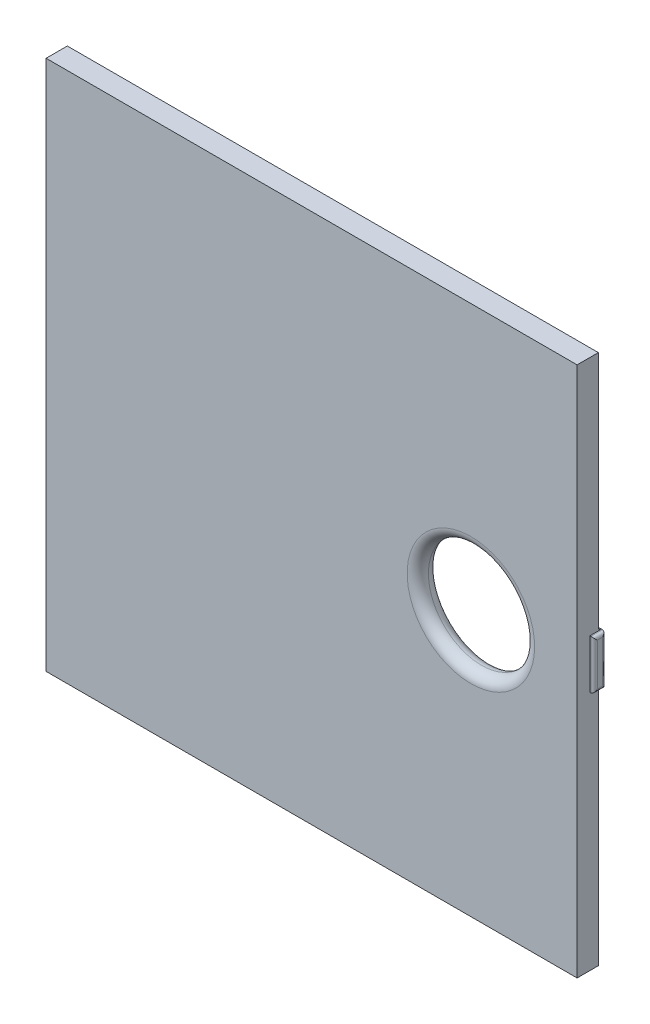
ISO-10303-21;
HEADER;
FILE_DESCRIPTION(('STEP AP214'),'2;1');
FILE_NAME('part.step','',(''),(''),'','','');
FILE_SCHEMA(('AUTOMOTIVE_DESIGN { 1 0 10303 214 1 1 1 1 }'));
ENDSEC;
DATA;
#1=APPLICATION_CONTEXT('core data for automotive mechanical design processes');
#2=APPLICATION_PROTOCOL_DEFINITION('international standard','automotive_design',2000,#1);
#3=PRODUCT_CONTEXT('',#1,'mechanical');
#4=PRODUCT('Part','Part','',(#3));
#5=PRODUCT_RELATED_PRODUCT_CATEGORY('part','',(#4));
#6=PRODUCT_DEFINITION_FORMATION('','',#4);
#7=PRODUCT_DEFINITION_CONTEXT('part definition',#1,'design');
#8=PRODUCT_DEFINITION('design','',#6,#7);
#9=PRODUCT_DEFINITION_SHAPE('','',#8);
#10=(LENGTH_UNIT() NAMED_UNIT(*) SI_UNIT(.MILLI.,.METRE.));
#11=(NAMED_UNIT(*) PLANE_ANGLE_UNIT() SI_UNIT($,.RADIAN.));
#12=(NAMED_UNIT(*) SI_UNIT($,.STERADIAN.) SOLID_ANGLE_UNIT());
#13=UNCERTAINTY_MEASURE_WITH_UNIT(LENGTH_MEASURE(1.E-05),#10,'distance_accuracy_value','');
#14=(GEOMETRIC_REPRESENTATION_CONTEXT(3) GLOBAL_UNCERTAINTY_ASSIGNED_CONTEXT((#13)) GLOBAL_UNIT_ASSIGNED_CONTEXT((#10,
#11,#12)) REPRESENTATION_CONTEXT('',''));
#15=CARTESIAN_POINT('',(0.,0.,0.));
#16=DIRECTION('',(0.,0.,1.));
#17=DIRECTION('',(1.,0.,0.));
#18=AXIS2_PLACEMENT_3D('',#15,#16,#17);
#19=CARTESIAN_POINT('',(0.,0.,0.));
#20=DIRECTION('',(0.,0.,1.));
#21=DIRECTION('',(1.,0.,0.));
#22=AXIS2_PLACEMENT_3D('',#19,#20,#21);
#23=PLANE('',#22);
#24=CARTESIAN_POINT('',(15.,0.,0.));
#25=DIRECTION('',(0.,0.,1.));
#26=DIRECTION('',(1.,0.,0.));
#27=AXIS2_PLACEMENT_3D('',#24,#25,#26);
#28=CIRCLE('',#27,6.);
#29=CARTESIAN_POINT('',(21.,0.,0.));
#30=VERTEX_POINT('',#29);
#31=EDGE_CURVE('E42',#30,#30,#28,.T.);
#32=ORIENTED_EDGE('',*,*,#31,.T.);
#33=EDGE_LOOP('',(#32));
#34=FACE_BOUND('',#33,.T.);
#35=DIRECTION('',(0.,-1.,0.));
#36=VECTOR('',#35,1.);
#37=CARTESIAN_POINT('',(23.5,0.,0.));
#38=LINE('',#37,#36);
#39=CARTESIAN_POINT('',(23.5,2.59999999999999,0.));
#40=VERTEX_POINT('',#39);
#41=CARTESIAN_POINT('',(23.5,-2.60000000000001,0.));
#42=VERTEX_POINT('',#41);
#43=EDGE_CURVE('E57',#40,#42,#38,.T.);
#44=ORIENTED_EDGE('',*,*,#43,.T.);
#45=DIRECTION('',(-1.,0.,0.));
#46=VECTOR('',#45,1.);
#47=CARTESIAN_POINT('',(25.,-2.60000000000001,0.));
#48=LINE('',#47,#46);
#49=CARTESIAN_POINT('',(25.,-2.60000000000001,0.));
#50=VERTEX_POINT('',#49);
#51=EDGE_CURVE('E265',#42,#50,#48,.F.);
#52=ORIENTED_EDGE('',*,*,#51,.T.);
#53=DIRECTION('',(0.,1.,0.));
#54=VECTOR('',#53,1.);
#55=CARTESIAN_POINT('',(25.,25.,0.));
#56=LINE('',#55,#54);
#57=CARTESIAN_POINT('',(25.,-25.,0.));
#58=VERTEX_POINT('',#57);
#59=EDGE_CURVE('E382',#58,#50,#56,.T.);
#60=ORIENTED_EDGE('',*,*,#59,.F.);
#61=DIRECTION('',(1.,0.,0.));
#62=VECTOR('',#61,1.);
#63=CARTESIAN_POINT('',(-25.,-25.,0.));
#64=LINE('',#63,#62);
#65=CARTESIAN_POINT('',(-25.,-25.,0.));
#66=VERTEX_POINT('',#65);
#67=EDGE_CURVE('E372',#66,#58,#64,.T.);
#68=ORIENTED_EDGE('',*,*,#67,.F.);
#69=DIRECTION('',(0.,-1.,0.));
#70=VECTOR('',#69,1.);
#71=CARTESIAN_POINT('',(-25.,25.,0.));
#72=LINE('',#71,#70);
#73=CARTESIAN_POINT('',(-25.,-21.8141428428542,0.));
#74=VERTEX_POINT('',#73);
#75=EDGE_CURVE('E379',#74,#66,#72,.T.);
#76=ORIENTED_EDGE('',*,*,#75,.F.);
#77=DIRECTION('',(1.,0.,0.));
#78=VECTOR('',#77,1.);
#79=CARTESIAN_POINT('',(0.,-21.8141428428542,0.));
#80=LINE('',#79,#78);
#81=CARTESIAN_POINT('',(-23.0858571571457,-21.8141428428542,0.));
#82=VERTEX_POINT('',#81);
#83=EDGE_CURVE('E346',#74,#82,#80,.T.);
#84=ORIENTED_EDGE('',*,*,#83,.T.);
#85=DIRECTION('',(0.,-1.,0.));
#86=VECTOR('',#85,1.);
#87=CARTESIAN_POINT('',(-23.0858571571457,0.,0.));
#88=LINE('',#87,#86);
#89=CARTESIAN_POINT('',(-23.0858571571457,-17.7858571571458,0.));
#90=VERTEX_POINT('',#89);
#91=EDGE_CURVE('E350',#82,#90,#88,.F.);
#92=ORIENTED_EDGE('',*,*,#91,.T.);
#93=DIRECTION('',(-1.,0.,0.));
#94=VECTOR('',#93,1.);
#95=CARTESIAN_POINT('',(0.,-17.7858571571458,0.));
#96=LINE('',#95,#94);
#97=CARTESIAN_POINT('',(-25.,-17.7858571571458,0.));
#98=VERTEX_POINT('',#97);
#99=EDGE_CURVE('E348',#90,#98,#96,.T.);
#100=ORIENTED_EDGE('',*,*,#99,.T.);
#101=CARTESIAN_POINT('',(-25.,17.7858571571457,0.));
#102=VERTEX_POINT('',#101);
#103=EDGE_CURVE('E378',#102,#98,#72,.T.);
#104=ORIENTED_EDGE('',*,*,#103,.F.);
#105=DIRECTION('',(1.,0.,0.));
#106=VECTOR('',#105,1.);
#107=CARTESIAN_POINT('',(0.,17.7858571571457,0.));
#108=LINE('',#107,#106);
#109=CARTESIAN_POINT('',(-23.0858571571457,17.7858571571457,0.));
#110=VERTEX_POINT('',#109);
#111=EDGE_CURVE('E355',#102,#110,#108,.T.);
#112=ORIENTED_EDGE('',*,*,#111,.T.);
#113=DIRECTION('',(0.,-1.,0.));
#114=VECTOR('',#113,1.);
#115=CARTESIAN_POINT('',(-23.0858571571457,0.,0.));
#116=LINE('',#115,#114);
#117=CARTESIAN_POINT('',(-23.0858571571457,21.8141428428543,0.));
#118=VERTEX_POINT('',#117);
#119=EDGE_CURVE('E357',#110,#118,#116,.F.);
#120=ORIENTED_EDGE('',*,*,#119,.T.);
#121=DIRECTION('',(-1.,0.,0.));
#122=VECTOR('',#121,1.);
#123=CARTESIAN_POINT('',(0.,21.8141428428543,0.));
#124=LINE('',#123,#122);
#125=CARTESIAN_POINT('',(-25.,21.8141428428543,0.));
#126=VERTEX_POINT('',#125);
#127=EDGE_CURVE('E352',#118,#126,#124,.T.);
#128=ORIENTED_EDGE('',*,*,#127,.T.);
#129=CARTESIAN_POINT('',(-25.,25.,0.));
#130=VERTEX_POINT('',#129);
#131=EDGE_CURVE('E375',#130,#126,#72,.T.);
#132=ORIENTED_EDGE('',*,*,#131,.F.);
#133=DIRECTION('',(-1.,0.,0.));
#134=VECTOR('',#133,1.);
#135=CARTESIAN_POINT('',(-25.,25.,0.));
#136=LINE('',#135,#134);
#137=CARTESIAN_POINT('',(25.,25.,0.));
#138=VERTEX_POINT('',#137);
#139=EDGE_CURVE('E380',#138,#130,#136,.T.);
#140=ORIENTED_EDGE('',*,*,#139,.F.);
#141=CARTESIAN_POINT('',(25.,2.59999999999999,0.));
#142=VERTEX_POINT('',#141);
#143=EDGE_CURVE('E385',#142,#138,#56,.T.);
#144=ORIENTED_EDGE('',*,*,#143,.F.);
#145=DIRECTION('',(1.,0.,0.));
#146=VECTOR('',#145,1.);
#147=CARTESIAN_POINT('',(23.8,2.59999999999999,0.));
#148=LINE('',#147,#146);
#149=EDGE_CURVE('E269',#142,#40,#148,.F.);
#150=ORIENTED_EDGE('',*,*,#149,.T.);
#151=EDGE_LOOP('',(#44,#52,#60,#68,#76,#84,#92,#100,#104,#112,#120,#128,#132,#140,#144,#150));
#152=FACE_BOUND('',#151,.T.);
#153=ADVANCED_FACE('F33',(#34,#152),#23,.F.);
#154=CARTESIAN_POINT('',(25.,25.,2.));
#155=DIRECTION('',(-1.,0.,0.));
#156=DIRECTION('',(0.,-1.,0.));
#157=AXIS2_PLACEMENT_3D('',#154,#155,#156);
#158=PLANE('',#157);
#159=DIRECTION('',(0.,0.,1.));
#160=VECTOR('',#159,1.);
#161=CARTESIAN_POINT('',(25.,2.29999999999999,2.));
#162=LINE('',#161,#160);
#163=CARTESIAN_POINT('',(25.,2.29999999999999,-0.29999999999999));
#164=VERTEX_POINT('',#163);
#165=CARTESIAN_POINT('',(25.,2.29999999999999,0.800000000000011));
#166=VERTEX_POINT('',#165);
#167=EDGE_CURVE('E49',#164,#166,#162,.T.);
#168=ORIENTED_EDGE('',*,*,#167,.F.);
#169=CARTESIAN_POINT('',(25.,2.59999999999999,-0.3));
#170=DIRECTION('',(-1.,0.,0.));
#171=DIRECTION('',(0.,-1.,0.));
#172=AXIS2_PLACEMENT_3D('',#169,#170,#171);
#173=CIRCLE('',#172,0.3);
#174=EDGE_CURVE('E245',#164,#142,#173,.T.);
#175=ORIENTED_EDGE('',*,*,#174,.T.);
#176=ORIENTED_EDGE('',*,*,#143,.T.);
#177=DIRECTION('',(0.,0.,-1.));
#178=VECTOR('',#177,1.);
#179=CARTESIAN_POINT('',(25.,25.,2.));
#180=LINE('',#179,#178);
#181=CARTESIAN_POINT('',(25.,25.,2.));
#182=VERTEX_POINT('',#181);
#183=EDGE_CURVE('E359',#182,#138,#180,.T.);
#184=ORIENTED_EDGE('',*,*,#183,.F.);
#185=DIRECTION('',(0.,1.,0.));
#186=VECTOR('',#185,1.);
#187=CARTESIAN_POINT('',(25.,25.,2.));
#188=LINE('',#187,#186);
#189=CARTESIAN_POINT('',(25.,-25.,2.));
#190=VERTEX_POINT('',#189);
#191=EDGE_CURVE('E374',#190,#182,#188,.T.);
#192=ORIENTED_EDGE('',*,*,#191,.F.);
#193=DIRECTION('',(0.,0.,-1.));
#194=VECTOR('',#193,1.);
#195=CARTESIAN_POINT('',(25.,-25.,2.));
#196=LINE('',#195,#194);
#197=EDGE_CURVE('E368',#190,#58,#196,.T.);
#198=ORIENTED_EDGE('',*,*,#197,.T.);
#199=ORIENTED_EDGE('',*,*,#59,.T.);
#200=CARTESIAN_POINT('',(25.,-2.60000000000001,-0.3));
#201=DIRECTION('',(-1.,0.,0.));
#202=DIRECTION('',(0.,-1.,0.));
#203=AXIS2_PLACEMENT_3D('',#200,#201,#202);
#204=CIRCLE('',#203,0.3);
#205=CARTESIAN_POINT('',(25.,-2.30000000000001,-0.29999999999999));
#206=VERTEX_POINT('',#205);
#207=EDGE_CURVE('E262',#50,#206,#204,.T.);
#208=ORIENTED_EDGE('',*,*,#207,.T.);
#209=DIRECTION('',(0.,0.,-1.));
#210=VECTOR('',#209,1.);
#211=CARTESIAN_POINT('',(25.,-2.30000000000001,2.));
#212=LINE('',#211,#210);
#213=CARTESIAN_POINT('',(25.,-2.30000000000001,0.800000000000011));
#214=VERTEX_POINT('',#213);
#215=EDGE_CURVE('E298',#214,#206,#212,.T.);
#216=ORIENTED_EDGE('',*,*,#215,.F.);
#217=DIRECTION('',(0.,-1.,0.));
#218=VECTOR('',#217,1.);
#219=CARTESIAN_POINT('',(25.,25.,0.800000000000011));
#220=LINE('',#219,#218);
#221=EDGE_CURVE('E300',#166,#214,#220,.T.);
#222=ORIENTED_EDGE('',*,*,#221,.F.);
#223=EDGE_LOOP('',(#168,#175,#176,#184,#192,#198,#199,#208,#216,#222));
#224=FACE_BOUND('',#223,.T.);
#225=ADVANCED_FACE('F486',(#224),#158,.F.);
#226=CARTESIAN_POINT('',(-25.,25.,2.));
#227=DIRECTION('',(1.,0.,0.));
#228=DIRECTION('',(0.,1.,0.));
#229=AXIS2_PLACEMENT_3D('',#226,#227,#228);
#230=PLANE('',#229);
#231=DIRECTION('',(0.,0.,-1.));
#232=VECTOR('',#231,1.);
#233=CARTESIAN_POINT('',(-25.,-18.5,2.));
#234=LINE('',#233,#232);
#235=CARTESIAN_POINT('',(-25.,-18.5,1.80000000000007));
#236=VERTEX_POINT('',#235);
#237=CARTESIAN_POINT('',(-25.,-18.5,-0.299999999999931));
#238=VERTEX_POINT('',#237);
#239=EDGE_CURVE('E425',#236,#238,#234,.T.);
#240=ORIENTED_EDGE('',*,*,#239,.F.);
#241=DIRECTION('',(0.,1.,0.));
#242=VECTOR('',#241,1.);
#243=CARTESIAN_POINT('',(-25.,-21.1,1.80000000000008));
#244=LINE('',#243,#242);
#245=CARTESIAN_POINT('',(-25.,-21.1,1.80000000000008));
#246=VERTEX_POINT('',#245);
#247=EDGE_CURVE('E337',#236,#246,#244,.F.);
#248=ORIENTED_EDGE('',*,*,#247,.T.);
#249=DIRECTION('',(0.,0.,1.));
#250=VECTOR('',#249,1.);
#251=CARTESIAN_POINT('',(-25.,-21.1,2.));
#252=LINE('',#251,#250);
#253=CARTESIAN_POINT('',(-25.,-21.1,-0.299999999999922));
#254=VERTEX_POINT('',#253);
#255=EDGE_CURVE('E423',#254,#246,#252,.T.);
#256=ORIENTED_EDGE('',*,*,#255,.F.);
#257=CARTESIAN_POINT('',(-25.,-21.8141428428542,-1.));
#258=DIRECTION('',(1.,0.,0.));
#259=DIRECTION('',(0.,1.,0.));
#260=AXIS2_PLACEMENT_3D('',#257,#258,#259);
#261=CIRCLE('',#260,1.);
#262=EDGE_CURVE('E328',#254,#74,#261,.T.);
#263=ORIENTED_EDGE('',*,*,#262,.T.);
#264=ORIENTED_EDGE('',*,*,#75,.T.);
#265=DIRECTION('',(0.,0.,-1.));
#266=VECTOR('',#265,1.);
#267=CARTESIAN_POINT('',(-25.,-25.,2.));
#268=LINE('',#267,#266);
#269=CARTESIAN_POINT('',(-25.,-25.,2.));
#270=VERTEX_POINT('',#269);
#271=EDGE_CURVE('E365',#270,#66,#268,.T.);
#272=ORIENTED_EDGE('',*,*,#271,.F.);
#273=DIRECTION('',(0.,-1.,0.));
#274=VECTOR('',#273,1.);
#275=CARTESIAN_POINT('',(-25.,25.,2.));
#276=LINE('',#275,#274);
#277=CARTESIAN_POINT('',(-25.,25.,2.));
#278=VERTEX_POINT('',#277);
#279=EDGE_CURVE('E387',#278,#270,#276,.T.);
#280=ORIENTED_EDGE('',*,*,#279,.F.);
#281=DIRECTION('',(0.,0.,-1.));
#282=VECTOR('',#281,1.);
#283=CARTESIAN_POINT('',(-25.,25.,2.));
#284=LINE('',#283,#282);
#285=EDGE_CURVE('E362',#278,#130,#284,.T.);
#286=ORIENTED_EDGE('',*,*,#285,.T.);
#287=ORIENTED_EDGE('',*,*,#131,.T.);
#288=CARTESIAN_POINT('',(-25.,21.8141428428543,-1.));
#289=DIRECTION('',(1.,0.,0.));
#290=DIRECTION('',(0.,1.,0.));
#291=AXIS2_PLACEMENT_3D('',#288,#289,#290);
#292=CIRCLE('',#291,1.);
#293=CARTESIAN_POINT('',(-25.,21.1,-0.299999999999995));
#294=VERTEX_POINT('',#293);
#295=EDGE_CURVE('E332',#126,#294,#292,.T.);
#296=ORIENTED_EDGE('',*,*,#295,.T.);
#297=DIRECTION('',(0.,0.,1.));
#298=VECTOR('',#297,1.);
#299=CARTESIAN_POINT('',(-25.,21.1,2.));
#300=LINE('',#299,#298);
#301=CARTESIAN_POINT('',(-25.,21.1,1.8));
#302=VERTEX_POINT('',#301);
#303=EDGE_CURVE('E393',#294,#302,#300,.T.);
#304=ORIENTED_EDGE('',*,*,#303,.T.);
#305=DIRECTION('',(0.,-1.,0.));
#306=VECTOR('',#305,1.);
#307=CARTESIAN_POINT('',(-25.,25.,1.8));
#308=LINE('',#307,#306);
#309=CARTESIAN_POINT('',(-25.,18.5,1.8));
#310=VERTEX_POINT('',#309);
#311=EDGE_CURVE('E340',#302,#310,#308,.T.);
#312=ORIENTED_EDGE('',*,*,#311,.T.);
#313=DIRECTION('',(0.,0.,-1.));
#314=VECTOR('',#313,1.);
#315=CARTESIAN_POINT('',(-25.,18.5,2.));
#316=LINE('',#315,#314);
#317=CARTESIAN_POINT('',(-25.,18.5,-0.299999999999995));
#318=VERTEX_POINT('',#317);
#319=EDGE_CURVE('E395',#310,#318,#316,.T.);
#320=ORIENTED_EDGE('',*,*,#319,.T.);
#321=CARTESIAN_POINT('',(-25.,17.7858571571457,-1.));
#322=DIRECTION('',(1.,0.,0.));
#323=DIRECTION('',(0.,1.,0.));
#324=AXIS2_PLACEMENT_3D('',#321,#322,#323);
#325=CIRCLE('',#324,1.);
#326=EDGE_CURVE('E330',#318,#102,#325,.T.);
#327=ORIENTED_EDGE('',*,*,#326,.T.);
#328=ORIENTED_EDGE('',*,*,#103,.T.);
#329=CARTESIAN_POINT('',(-25.,-17.7858571571458,-1.));
#330=DIRECTION('',(1.,0.,0.));
#331=DIRECTION('',(0.,1.,0.));
#332=AXIS2_PLACEMENT_3D('',#329,#330,#331);
#333=CIRCLE('',#332,1.);
#334=EDGE_CURVE('E325',#98,#238,#333,.T.);
#335=ORIENTED_EDGE('',*,*,#334,.T.);
#336=EDGE_LOOP('',(#240,#248,#256,#263,#264,#272,#280,#286,#287,#296,#304,#312,#320,#327,#328,#335));
#337=FACE_BOUND('',#336,.T.);
#338=ADVANCED_FACE('F514',(#337),#230,.F.);
#339=CARTESIAN_POINT('',(-25.,25.,2.));
#340=DIRECTION('',(0.,-1.,0.));
#341=DIRECTION('',(0.,0.,-1.));
#342=AXIS2_PLACEMENT_3D('',#339,#340,#341);
#343=PLANE('',#342);
#344=ORIENTED_EDGE('',*,*,#139,.T.);
#345=ORIENTED_EDGE('',*,*,#285,.F.);
#346=DIRECTION('',(-1.,0.,0.));
#347=VECTOR('',#346,1.);
#348=CARTESIAN_POINT('',(-25.,25.,2.));
#349=LINE('',#348,#347);
#350=EDGE_CURVE('E389',#182,#278,#349,.T.);
#351=ORIENTED_EDGE('',*,*,#350,.F.);
#352=ORIENTED_EDGE('',*,*,#183,.T.);
#353=EDGE_LOOP('',(#344,#345,#351,#352));
#354=FACE_BOUND('',#353,.T.);
#355=ADVANCED_FACE('F561',(#354),#343,.F.);
#356=CARTESIAN_POINT('',(-25.,-25.,2.));
#357=DIRECTION('',(0.,1.,0.));
#358=DIRECTION('',(0.,0.,1.));
#359=AXIS2_PLACEMENT_3D('',#356,#357,#358);
#360=PLANE('',#359);
#361=ORIENTED_EDGE('',*,*,#67,.T.);
#362=ORIENTED_EDGE('',*,*,#197,.F.);
#363=DIRECTION('',(1.,0.,0.));
#364=VECTOR('',#363,1.);
#365=CARTESIAN_POINT('',(-25.,-25.,2.));
#366=LINE('',#365,#364);
#367=EDGE_CURVE('E371',#270,#190,#366,.T.);
#368=ORIENTED_EDGE('',*,*,#367,.F.);
#369=ORIENTED_EDGE('',*,*,#271,.T.);
#370=EDGE_LOOP('',(#361,#362,#368,#369));
#371=FACE_BOUND('',#370,.T.);
#372=ADVANCED_FACE('F492',(#371),#360,.F.);
#373=CARTESIAN_POINT('',(0.,0.,2.));
#374=DIRECTION('',(0.,0.,1.));
#375=DIRECTION('',(1.,0.,0.));
#376=AXIS2_PLACEMENT_3D('',#373,#374,#375);
#377=PLANE('',#376);
#378=CARTESIAN_POINT('',(15.,0.,2.));
#379=DIRECTION('',(0.,0.,1.));
#380=DIRECTION('',(1.,0.,0.));
#381=AXIS2_PLACEMENT_3D('',#378,#379,#380);
#382=CIRCLE('',#381,6.);
#383=CARTESIAN_POINT('',(21.,0.,2.));
#384=VERTEX_POINT('',#383);
#385=EDGE_CURVE('E11',#384,#384,#382,.F.);
#386=ORIENTED_EDGE('',*,*,#385,.T.);
#387=EDGE_LOOP('',(#386));
#388=FACE_BOUND('',#387,.T.);
#389=ORIENTED_EDGE('',*,*,#191,.T.);
#390=ORIENTED_EDGE('',*,*,#350,.T.);
#391=ORIENTED_EDGE('',*,*,#279,.T.);
#392=ORIENTED_EDGE('',*,*,#367,.T.);
#393=EDGE_LOOP('',(#389,#390,#391,#392));
#394=FACE_BOUND('',#393,.T.);
#395=ADVANCED_FACE('F557',(#388,#394),#377,.T.);
#396=CARTESIAN_POINT('',(-23.8,18.5,0.800000000000004));
#397=DIRECTION('',(0.,0.,1.));
#398=DIRECTION('',(1.,0.,0.));
#399=AXIS2_PLACEMENT_3D('',#396,#397,#398);
#400=PLANE('',#399);
#401=DIRECTION('',(-1.,0.,0.));
#402=VECTOR('',#401,1.);
#403=CARTESIAN_POINT('',(-23.8,18.5,0.800000000000004));
#404=LINE('',#403,#402);
#405=CARTESIAN_POINT('',(-26.,18.5,0.800000000000004));
#406=VERTEX_POINT('',#405);
#407=CARTESIAN_POINT('',(-26.2,18.5,0.800000000000004));
#408=VERTEX_POINT('',#407);
#409=EDGE_CURVE('E406',#406,#408,#404,.T.);
#410=ORIENTED_EDGE('',*,*,#409,.F.);
#411=DIRECTION('',(0.,-1.,0.));
#412=VECTOR('',#411,1.);
#413=CARTESIAN_POINT('',(-26.,18.5,0.800000000000004));
#414=LINE('',#413,#412);
#415=CARTESIAN_POINT('',(-26.,21.1,0.800000000000004));
#416=VERTEX_POINT('',#415);
#417=EDGE_CURVE('E335',#406,#416,#414,.F.);
#418=ORIENTED_EDGE('',*,*,#417,.T.);
#419=DIRECTION('',(-1.,0.,0.));
#420=VECTOR('',#419,1.);
#421=CARTESIAN_POINT('',(-23.8,21.1,0.800000000000004));
#422=LINE('',#421,#420);
#423=CARTESIAN_POINT('',(-26.2,21.1,0.800000000000004));
#424=VERTEX_POINT('',#423);
#425=EDGE_CURVE('E397',#416,#424,#422,.T.);
#426=ORIENTED_EDGE('',*,*,#425,.T.);
#427=DIRECTION('',(0.,1.,0.));
#428=VECTOR('',#427,1.);
#429=CARTESIAN_POINT('',(-26.2,18.5,0.800000000000004));
#430=LINE('',#429,#428);
#431=EDGE_CURVE('E411',#408,#424,#430,.T.);
#432=ORIENTED_EDGE('',*,*,#431,.F.);
#433=EDGE_LOOP('',(#410,#418,#426,#432));
#434=FACE_BOUND('',#433,.T.);
#435=ADVANCED_FACE('F623',(#434),#400,.T.);
#436=CARTESIAN_POINT('',(-23.8,21.1,0.800000000000004));
#437=DIRECTION('',(0.,1.,0.));
#438=DIRECTION('',(-1.,0.,0.));
#439=AXIS2_PLACEMENT_3D('',#436,#437,#438);
#440=PLANE('',#439);
#441=ORIENTED_EDGE('',*,*,#303,.F.);
#442=DIRECTION('',(-1.,0.,0.));
#443=VECTOR('',#442,1.);
#444=CARTESIAN_POINT('',(-23.8,21.1,-0.299999999999995));
#445=LINE('',#444,#443);
#446=CARTESIAN_POINT('',(-26.2,21.1,-0.299999999999995));
#447=VERTEX_POINT('',#446);
#448=EDGE_CURVE('E402',#294,#447,#445,.T.);
#449=ORIENTED_EDGE('',*,*,#448,.T.);
#450=DIRECTION('',(0.,0.,-1.));
#451=VECTOR('',#450,1.);
#452=CARTESIAN_POINT('',(-26.2,21.1,0.800000000000004));
#453=LINE('',#452,#451);
#454=EDGE_CURVE('E420',#424,#447,#453,.T.);
#455=ORIENTED_EDGE('',*,*,#454,.F.);
#456=ORIENTED_EDGE('',*,*,#425,.F.);
#457=CARTESIAN_POINT('',(-26.,21.1,1.8));
#458=DIRECTION('',(0.,1.,0.));
#459=DIRECTION('',(-1.,0.,0.));
#460=AXIS2_PLACEMENT_3D('',#457,#458,#459);
#461=CIRCLE('',#460,1.);
#462=EDGE_CURVE('E303',#416,#302,#461,.F.);
#463=ORIENTED_EDGE('',*,*,#462,.T.);
#464=EDGE_LOOP('',(#441,#449,#455,#456,#463));
#465=FACE_BOUND('',#464,.T.);
#466=ADVANCED_FACE('F638',(#465),#440,.T.);
#467=CARTESIAN_POINT('',(-23.8,18.5,-0.299999999999995));
#468=DIRECTION('',(0.,-1.,0.));
#469=DIRECTION('',(1.,0.,0.));
#470=AXIS2_PLACEMENT_3D('',#467,#468,#469);
#471=PLANE('',#470);
#472=DIRECTION('',(-1.,0.,0.));
#473=VECTOR('',#472,1.);
#474=CARTESIAN_POINT('',(-23.8,18.5,-0.299999999999995));
#475=LINE('',#474,#473);
#476=CARTESIAN_POINT('',(-26.2,18.5,-0.299999999999995));
#477=VERTEX_POINT('',#476);
#478=EDGE_CURVE('E401',#318,#477,#475,.T.);
#479=ORIENTED_EDGE('',*,*,#478,.F.);
#480=ORIENTED_EDGE('',*,*,#319,.F.);
#481=CARTESIAN_POINT('',(-26.,18.5,1.8));
#482=DIRECTION('',(0.,-1.,0.));
#483=DIRECTION('',(1.,0.,0.));
#484=AXIS2_PLACEMENT_3D('',#481,#482,#483);
#485=CIRCLE('',#484,1.);
#486=EDGE_CURVE('E318',#310,#406,#485,.F.);
#487=ORIENTED_EDGE('',*,*,#486,.T.);
#488=ORIENTED_EDGE('',*,*,#409,.T.);
#489=DIRECTION('',(0.,0.,1.));
#490=VECTOR('',#489,1.);
#491=CARTESIAN_POINT('',(-26.2,18.5,-0.299999999999995));
#492=LINE('',#491,#490);
#493=EDGE_CURVE('E414',#477,#408,#492,.T.);
#494=ORIENTED_EDGE('',*,*,#493,.F.);
#495=EDGE_LOOP('',(#479,#480,#487,#488,#494));
#496=FACE_BOUND('',#495,.T.);
#497=ADVANCED_FACE('F648',(#496),#471,.T.);
#498=CARTESIAN_POINT('',(-23.8,21.1,-0.299999999999995));
#499=DIRECTION('',(0.,0.,-1.));
#500=DIRECTION('',(-1.,0.,0.));
#501=AXIS2_PLACEMENT_3D('',#498,#499,#500);
#502=PLANE('',#501);
#503=CARTESIAN_POINT('',(-23.8,18.5,-0.299999999999995));
#504=VERTEX_POINT('',#503);
#505=EDGE_CURVE('E403',#504,#318,#475,.T.);
#506=ORIENTED_EDGE('',*,*,#505,.T.);
#507=ORIENTED_EDGE('',*,*,#478,.T.);
#508=DIRECTION('',(0.,-1.,0.));
#509=VECTOR('',#508,1.);
#510=CARTESIAN_POINT('',(-26.2,21.1,-0.299999999999995));
#511=LINE('',#510,#509);
#512=EDGE_CURVE('E417',#447,#477,#511,.T.);
#513=ORIENTED_EDGE('',*,*,#512,.F.);
#514=ORIENTED_EDGE('',*,*,#448,.F.);
#515=CARTESIAN_POINT('',(-23.8,21.1,-0.299999999999995));
#516=VERTEX_POINT('',#515);
#517=EDGE_CURVE('E398',#516,#294,#445,.T.);
#518=ORIENTED_EDGE('',*,*,#517,.F.);
#519=DIRECTION('',(0.,-1.,0.));
#520=VECTOR('',#519,1.);
#521=CARTESIAN_POINT('',(-23.8,21.1,-0.299999999999995));
#522=LINE('',#521,#520);
#523=EDGE_CURVE('E409',#516,#504,#522,.T.);
#524=ORIENTED_EDGE('',*,*,#523,.T.);
#525=EDGE_LOOP('',(#506,#507,#513,#514,#518,#524));
#526=FACE_BOUND('',#525,.T.);
#527=ADVANCED_FACE('F634',(#526),#502,.T.);
#528=CARTESIAN_POINT('',(-26.2,0.,0.));
#529=DIRECTION('',(-1.,0.,0.));
#530=DIRECTION('',(0.,0.,1.));
#531=AXIS2_PLACEMENT_3D('',#528,#529,#530);
#532=PLANE('',#531);
#533=ORIENTED_EDGE('',*,*,#454,.T.);
#534=ORIENTED_EDGE('',*,*,#512,.T.);
#535=ORIENTED_EDGE('',*,*,#493,.T.);
#536=ORIENTED_EDGE('',*,*,#431,.T.);
#537=EDGE_LOOP('',(#533,#534,#535,#536));
#538=FACE_BOUND('',#537,.T.);
#539=ADVANCED_FACE('F543',(#538),#532,.T.);
#540=CARTESIAN_POINT('',(-23.8,-18.5,0.800000000000069));
#541=DIRECTION('',(0.,0.,-1.));
#542=DIRECTION('',(0.,1.,0.));
#543=AXIS2_PLACEMENT_3D('',#540,#541,#542);
#544=PLANE('',#543);
#545=DIRECTION('',(-1.,0.,0.));
#546=VECTOR('',#545,1.);
#547=CARTESIAN_POINT('',(-23.8,-21.1,0.800000000000078));
#548=LINE('',#547,#546);
#549=CARTESIAN_POINT('',(-26.,-21.1,0.800000000000078));
#550=VERTEX_POINT('',#549);
#551=CARTESIAN_POINT('',(-26.2,-21.1,0.800000000000078));
#552=VERTEX_POINT('',#551);
#553=EDGE_CURVE('E442',#550,#552,#548,.T.);
#554=ORIENTED_EDGE('',*,*,#553,.F.);
#555=DIRECTION('',(0.,1.,0.));
#556=VECTOR('',#555,1.);
#557=CARTESIAN_POINT('',(-26.,-18.5,0.800000000000069));
#558=LINE('',#557,#556);
#559=CARTESIAN_POINT('',(-26.,-18.5,0.800000000000069));
#560=VERTEX_POINT('',#559);
#561=EDGE_CURVE('E343',#550,#560,#558,.T.);
#562=ORIENTED_EDGE('',*,*,#561,.T.);
#563=DIRECTION('',(-1.,0.,0.));
#564=VECTOR('',#563,1.);
#565=CARTESIAN_POINT('',(-23.8,-18.5,0.800000000000069));
#566=LINE('',#565,#564);
#567=CARTESIAN_POINT('',(-26.2,-18.5,0.800000000000069));
#568=VERTEX_POINT('',#567);
#569=EDGE_CURVE('E444',#560,#568,#566,.T.);
#570=ORIENTED_EDGE('',*,*,#569,.T.);
#571=DIRECTION('',(0.,-1.,0.));
#572=VECTOR('',#571,1.);
#573=CARTESIAN_POINT('',(-26.2,-18.5,0.800000000000069));
#574=LINE('',#573,#572);
#575=EDGE_CURVE('E436',#568,#552,#574,.T.);
#576=ORIENTED_EDGE('',*,*,#575,.T.);
#577=EDGE_LOOP('',(#554,#562,#570,#576));
#578=FACE_BOUND('',#577,.T.);
#579=ADVANCED_FACE('F528',(#578),#544,.F.);
#580=CARTESIAN_POINT('',(-23.8,-21.1,0.800000000000078));
#581=DIRECTION('',(0.,1.,0.));
#582=DIRECTION('',(-1.,0.,0.));
#583=AXIS2_PLACEMENT_3D('',#580,#581,#582);
#584=PLANE('',#583);
#585=DIRECTION('',(-1.,0.,0.));
#586=VECTOR('',#585,1.);
#587=CARTESIAN_POINT('',(-23.8,-21.1,-0.299999999999922));
#588=LINE('',#587,#586);
#589=CARTESIAN_POINT('',(-26.2,-21.1,-0.299999999999922));
#590=VERTEX_POINT('',#589);
#591=EDGE_CURVE('E313',#254,#590,#588,.T.);
#592=ORIENTED_EDGE('',*,*,#591,.F.);
#593=ORIENTED_EDGE('',*,*,#255,.T.);
#594=CARTESIAN_POINT('',(-26.,-21.1,1.80000000000008));
#595=DIRECTION('',(0.,1.,0.));
#596=DIRECTION('',(-1.,0.,0.));
#597=AXIS2_PLACEMENT_3D('',#594,#595,#596);
#598=CIRCLE('',#597,1.);
#599=EDGE_CURVE('E320',#246,#550,#598,.T.);
#600=ORIENTED_EDGE('',*,*,#599,.T.);
#601=ORIENTED_EDGE('',*,*,#553,.T.);
#602=DIRECTION('',(0.,0.,-1.));
#603=VECTOR('',#602,1.);
#604=CARTESIAN_POINT('',(-26.2,-21.1,0.800000000000078));
#605=LINE('',#604,#603);
#606=EDGE_CURVE('E427',#552,#590,#605,.T.);
#607=ORIENTED_EDGE('',*,*,#606,.T.);
#608=EDGE_LOOP('',(#592,#593,#600,#601,#607));
#609=FACE_BOUND('',#608,.T.);
#610=ADVANCED_FACE('F535',(#609),#584,.F.);
#611=CARTESIAN_POINT('',(-23.8,-18.5,-0.299999999999931));
#612=DIRECTION('',(0.,-1.,0.));
#613=DIRECTION('',(1.,0.,0.));
#614=AXIS2_PLACEMENT_3D('',#611,#612,#613);
#615=PLANE('',#614);
#616=ORIENTED_EDGE('',*,*,#239,.T.);
#617=DIRECTION('',(-1.,0.,0.));
#618=VECTOR('',#617,1.);
#619=CARTESIAN_POINT('',(-23.8,-18.5,-0.299999999999931));
#620=LINE('',#619,#618);
#621=CARTESIAN_POINT('',(-26.2,-18.5,-0.299999999999931));
#622=VERTEX_POINT('',#621);
#623=EDGE_CURVE('E449',#238,#622,#620,.T.);
#624=ORIENTED_EDGE('',*,*,#623,.T.);
#625=DIRECTION('',(0.,0.,1.));
#626=VECTOR('',#625,1.);
#627=CARTESIAN_POINT('',(-26.2,-18.5,-0.299999999999931));
#628=LINE('',#627,#626);
#629=EDGE_CURVE('E433',#622,#568,#628,.T.);
#630=ORIENTED_EDGE('',*,*,#629,.T.);
#631=ORIENTED_EDGE('',*,*,#569,.F.);
#632=CARTESIAN_POINT('',(-26.,-18.5,1.80000000000007));
#633=DIRECTION('',(0.,-1.,0.));
#634=DIRECTION('',(1.,0.,0.));
#635=AXIS2_PLACEMENT_3D('',#632,#633,#634);
#636=CIRCLE('',#635,1.);
#637=EDGE_CURVE('E322',#560,#236,#636,.T.);
#638=ORIENTED_EDGE('',*,*,#637,.T.);
#639=EDGE_LOOP('',(#616,#624,#630,#631,#638));
#640=FACE_BOUND('',#639,.T.);
#641=ADVANCED_FACE('F520',(#640),#615,.F.);
#642=CARTESIAN_POINT('',(-23.8,-21.1,-0.299999999999922));
#643=DIRECTION('',(0.,0.,1.));
#644=DIRECTION('',(0.,-1.,0.));
#645=AXIS2_PLACEMENT_3D('',#642,#643,#644);
#646=PLANE('',#645);
#647=CARTESIAN_POINT('',(-23.8,-21.1,-0.299999999999922));
#648=VERTEX_POINT('',#647);
#649=EDGE_CURVE('E450',#648,#254,#588,.T.);
#650=ORIENTED_EDGE('',*,*,#649,.T.);
#651=ORIENTED_EDGE('',*,*,#591,.T.);
#652=DIRECTION('',(0.,1.,0.));
#653=VECTOR('',#652,1.);
#654=CARTESIAN_POINT('',(-26.2,-21.1,-0.299999999999922));
#655=LINE('',#654,#653);
#656=EDGE_CURVE('E430',#590,#622,#655,.T.);
#657=ORIENTED_EDGE('',*,*,#656,.T.);
#658=ORIENTED_EDGE('',*,*,#623,.F.);
#659=CARTESIAN_POINT('',(-23.8,-18.5,-0.299999999999931));
#660=VERTEX_POINT('',#659);
#661=EDGE_CURVE('E446',#660,#238,#620,.T.);
#662=ORIENTED_EDGE('',*,*,#661,.F.);
#663=DIRECTION('',(0.,1.,0.));
#664=VECTOR('',#663,1.);
#665=CARTESIAN_POINT('',(-23.8,-21.1,-0.299999999999922));
#666=LINE('',#665,#664);
#667=EDGE_CURVE('E439',#648,#660,#666,.T.);
#668=ORIENTED_EDGE('',*,*,#667,.F.);
#669=EDGE_LOOP('',(#650,#651,#657,#658,#662,#668));
#670=FACE_BOUND('',#669,.T.);
#671=ADVANCED_FACE('F516',(#670),#646,.F.);
#672=CARTESIAN_POINT('',(-26.2,0.,0.));
#673=DIRECTION('',(1.,0.,0.));
#674=DIRECTION('',(0.,0.,-1.));
#675=AXIS2_PLACEMENT_3D('',#672,#673,#674);
#676=PLANE('',#675);
#677=ORIENTED_EDGE('',*,*,#606,.F.);
#678=ORIENTED_EDGE('',*,*,#575,.F.);
#679=ORIENTED_EDGE('',*,*,#629,.F.);
#680=ORIENTED_EDGE('',*,*,#656,.F.);
#681=EDGE_LOOP('',(#677,#678,#679,#680));
#682=FACE_BOUND('',#681,.T.);
#683=ADVANCED_FACE('F525',(#682),#676,.F.);
#684=CARTESIAN_POINT('',(-23.8,17.7858571571457,-1.));
#685=DIRECTION('',(1.,0.,0.));
#686=DIRECTION('',(0.,1.,0.));
#687=AXIS2_PLACEMENT_3D('',#684,#685,#686);
#688=CYLINDRICAL_SURFACE('',#687,1.);
#689=ORIENTED_EDGE('',*,*,#326,.F.);
#690=ORIENTED_EDGE('',*,*,#505,.F.);
#691=CARTESIAN_POINT('',(-23.0858571571457,17.7858571571457,-1.));
#692=DIRECTION('',(-0.707106781186547,-0.707106781186548,0.));
#693=DIRECTION('',(0.707106781186548,-0.707106781186547,0.));
#694=AXIS2_PLACEMENT_3D('',#691,#692,#693);
#695=ELLIPSE('',#694,1.41421356237309,1.);
#696=EDGE_CURVE('E310',#110,#504,#695,.T.);
#697=ORIENTED_EDGE('',*,*,#696,.F.);
#698=ORIENTED_EDGE('',*,*,#111,.F.);
#699=EDGE_LOOP('',(#689,#690,#697,#698));
#700=FACE_BOUND('',#699,.T.);
#701=ADVANCED_FACE('F574',(#700),#688,.F.);
#702=CARTESIAN_POINT('',(-23.0858571571457,0.,-1.));
#703=DIRECTION('',(0.,-1.,0.));
#704=DIRECTION('',(0.,0.,-1.));
#705=AXIS2_PLACEMENT_3D('',#702,#703,#704);
#706=CYLINDRICAL_SURFACE('',#705,1.);
#707=ORIENTED_EDGE('',*,*,#696,.T.);
#708=ORIENTED_EDGE('',*,*,#523,.F.);
#709=CARTESIAN_POINT('',(-23.0858571571457,21.8141428428543,-1.));
#710=DIRECTION('',(0.707106781186548,-0.707106781186547,0.));
#711=DIRECTION('',(-0.707106781186547,-0.707106781186548,0.));
#712=AXIS2_PLACEMENT_3D('',#709,#710,#711);
#713=ELLIPSE('',#712,1.4142135623731,1.);
#714=EDGE_CURVE('E307',#118,#516,#713,.T.);
#715=ORIENTED_EDGE('',*,*,#714,.F.);
#716=ORIENTED_EDGE('',*,*,#119,.F.);
#717=EDGE_LOOP('',(#707,#708,#715,#716));
#718=FACE_BOUND('',#717,.T.);
#719=ADVANCED_FACE('F570',(#718),#706,.F.);
#720=CARTESIAN_POINT('',(-23.8,21.8141428428543,-1.));
#721=DIRECTION('',(-1.,0.,0.));
#722=DIRECTION('',(0.,-1.,0.));
#723=AXIS2_PLACEMENT_3D('',#720,#721,#722);
#724=CYLINDRICAL_SURFACE('',#723,1.);
#725=ORIENTED_EDGE('',*,*,#714,.T.);
#726=ORIENTED_EDGE('',*,*,#517,.T.);
#727=ORIENTED_EDGE('',*,*,#295,.F.);
#728=ORIENTED_EDGE('',*,*,#127,.F.);
#729=EDGE_LOOP('',(#725,#726,#727,#728));
#730=FACE_BOUND('',#729,.T.);
#731=ADVANCED_FACE('F567',(#730),#724,.F.);
#732=CARTESIAN_POINT('',(-23.8,-17.7858571571458,-1.));
#733=DIRECTION('',(-1.,0.,0.));
#734=DIRECTION('',(0.,-1.,0.));
#735=AXIS2_PLACEMENT_3D('',#732,#733,#734);
#736=CYLINDRICAL_SURFACE('',#735,1.);
#737=ORIENTED_EDGE('',*,*,#334,.F.);
#738=ORIENTED_EDGE('',*,*,#99,.F.);
#739=CARTESIAN_POINT('',(-23.0858571571457,-17.7858571571458,-0.999999999999969));
#740=DIRECTION('',(0.707106781186548,-0.707106781186547,0.));
#741=DIRECTION('',(-0.707106781186547,-0.707106781186548,0.));
#742=AXIS2_PLACEMENT_3D('',#739,#740,#741);
#743=ELLIPSE('',#742,1.4142135623731,1.);
#744=EDGE_CURVE('E304',#660,#90,#743,.F.);
#745=ORIENTED_EDGE('',*,*,#744,.F.);
#746=ORIENTED_EDGE('',*,*,#661,.T.);
#747=EDGE_LOOP('',(#737,#738,#745,#746));
#748=FACE_BOUND('',#747,.T.);
#749=ADVANCED_FACE('F512',(#748),#736,.F.);
#750=CARTESIAN_POINT('',(-23.0858571571457,0.,-1.));
#751=DIRECTION('',(0.,-1.,0.));
#752=DIRECTION('',(0.,0.,-1.));
#753=AXIS2_PLACEMENT_3D('',#750,#751,#752);
#754=CYLINDRICAL_SURFACE('',#753,1.);
#755=ORIENTED_EDGE('',*,*,#744,.T.);
#756=ORIENTED_EDGE('',*,*,#91,.F.);
#757=CARTESIAN_POINT('',(-23.0858571571457,-21.8141428428542,-0.999999999999962));
#758=DIRECTION('',(-0.707106781186547,-0.707106781186548,0.));
#759=DIRECTION('',(0.707106781186548,-0.707106781186547,0.));
#760=AXIS2_PLACEMENT_3D('',#757,#758,#759);
#761=ELLIPSE('',#760,1.41421356237309,1.);
#762=EDGE_CURVE('E246',#648,#82,#761,.F.);
#763=ORIENTED_EDGE('',*,*,#762,.F.);
#764=ORIENTED_EDGE('',*,*,#667,.T.);
#765=EDGE_LOOP('',(#755,#756,#763,#764));
#766=FACE_BOUND('',#765,.T.);
#767=ADVANCED_FACE('F505',(#766),#754,.F.);
#768=CARTESIAN_POINT('',(-23.8,-21.8141428428542,-1.));
#769=DIRECTION('',(1.,0.,0.));
#770=DIRECTION('',(0.,1.,0.));
#771=AXIS2_PLACEMENT_3D('',#768,#769,#770);
#772=CYLINDRICAL_SURFACE('',#771,1.);
#773=ORIENTED_EDGE('',*,*,#762,.T.);
#774=ORIENTED_EDGE('',*,*,#83,.F.);
#775=ORIENTED_EDGE('',*,*,#262,.F.);
#776=ORIENTED_EDGE('',*,*,#649,.F.);
#777=EDGE_LOOP('',(#773,#774,#775,#776));
#778=FACE_BOUND('',#777,.T.);
#779=ADVANCED_FACE('F500',(#778),#772,.F.);
#780=CARTESIAN_POINT('',(-26.,-18.5,1.80000000000007));
#781=DIRECTION('',(0.,-1.,0.));
#782=DIRECTION('',(0.,0.,-1.));
#783=AXIS2_PLACEMENT_3D('',#780,#781,#782);
#784=CYLINDRICAL_SURFACE('',#783,1.);
#785=ORIENTED_EDGE('',*,*,#599,.F.);
#786=ORIENTED_EDGE('',*,*,#247,.F.);
#787=ORIENTED_EDGE('',*,*,#637,.F.);
#788=ORIENTED_EDGE('',*,*,#561,.F.);
#789=EDGE_LOOP('',(#785,#786,#787,#788));
#790=FACE_BOUND('',#789,.T.);
#791=ADVANCED_FACE('F533',(#790),#784,.F.);
#792=CARTESIAN_POINT('',(-26.,25.,1.8));
#793=DIRECTION('',(0.,-1.,0.));
#794=DIRECTION('',(1.,0.,0.));
#795=AXIS2_PLACEMENT_3D('',#792,#793,#794);
#796=CYLINDRICAL_SURFACE('',#795,1.);
#797=ORIENTED_EDGE('',*,*,#462,.F.);
#798=ORIENTED_EDGE('',*,*,#417,.F.);
#799=ORIENTED_EDGE('',*,*,#486,.F.);
#800=ORIENTED_EDGE('',*,*,#311,.F.);
#801=EDGE_LOOP('',(#797,#798,#799,#800));
#802=FACE_BOUND('',#801,.T.);
#803=ADVANCED_FACE('F587',(#802),#796,.F.);
#804=CARTESIAN_POINT('',(23.8,2.29999999999999,0.800000000000011));
#805=DIRECTION('',(0.,-1.,0.));
#806=DIRECTION('',(1.,0.,0.));
#807=AXIS2_PLACEMENT_3D('',#804,#805,#806);
#808=PLANE('',#807);
#809=DIRECTION('',(1.,0.,0.));
#810=VECTOR('',#809,1.);
#811=CARTESIAN_POINT('',(23.8,2.29999999999999,-0.29999999999999));
#812=LINE('',#811,#810);
#813=CARTESIAN_POINT('',(25.1,2.29999999999999,-0.29999999999999));
#814=VERTEX_POINT('',#813);
#815=EDGE_CURVE('E247',#164,#814,#812,.T.);
#816=ORIENTED_EDGE('',*,*,#815,.F.);
#817=ORIENTED_EDGE('',*,*,#167,.T.);
#818=DIRECTION('',(1.,0.,0.));
#819=VECTOR('',#818,1.);
#820=CARTESIAN_POINT('',(23.8,2.29999999999999,0.800000000000011));
#821=LINE('',#820,#819);
#822=CARTESIAN_POINT('',(25.1,2.29999999999999,0.800000000000011));
#823=VERTEX_POINT('',#822);
#824=EDGE_CURVE('E237',#166,#823,#821,.T.);
#825=ORIENTED_EDGE('',*,*,#824,.T.);
#826=DIRECTION('',(0.,0.,-1.));
#827=VECTOR('',#826,1.);
#828=CARTESIAN_POINT('',(25.1,2.29999999999999,0.800000000000011));
#829=LINE('',#828,#827);
#830=EDGE_CURVE('E272',#823,#814,#829,.T.);
#831=ORIENTED_EDGE('',*,*,#830,.T.);
#832=EDGE_LOOP('',(#816,#817,#825,#831));
#833=FACE_BOUND('',#832,.T.);
#834=ADVANCED_FACE('F462',(#833),#808,.F.);
#835=CARTESIAN_POINT('',(23.8,-2.30000000000001,-0.29999999999999));
#836=DIRECTION('',(0.,1.,0.));
#837=DIRECTION('',(-1.,0.,0.));
#838=AXIS2_PLACEMENT_3D('',#835,#836,#837);
#839=PLANE('',#838);
#840=ORIENTED_EDGE('',*,*,#215,.T.);
#841=DIRECTION('',(1.,0.,0.));
#842=VECTOR('',#841,1.);
#843=CARTESIAN_POINT('',(23.8,-2.30000000000001,-0.29999999999999));
#844=LINE('',#843,#842);
#845=CARTESIAN_POINT('',(25.1,-2.30000000000001,-0.29999999999999));
#846=VERTEX_POINT('',#845);
#847=EDGE_CURVE('E454',#206,#846,#844,.T.);
#848=ORIENTED_EDGE('',*,*,#847,.T.);
#849=DIRECTION('',(0.,0.,1.));
#850=VECTOR('',#849,1.);
#851=CARTESIAN_POINT('',(25.1,-2.30000000000001,-0.29999999999999));
#852=LINE('',#851,#850);
#853=CARTESIAN_POINT('',(25.1,-2.30000000000001,0.800000000000011));
#854=VERTEX_POINT('',#853);
#855=EDGE_CURVE('E283',#846,#854,#852,.T.);
#856=ORIENTED_EDGE('',*,*,#855,.T.);
#857=DIRECTION('',(1.,0.,0.));
#858=VECTOR('',#857,1.);
#859=CARTESIAN_POINT('',(23.8,-2.30000000000001,0.800000000000011));
#860=LINE('',#859,#858);
#861=EDGE_CURVE('E455',#214,#854,#860,.T.);
#862=ORIENTED_EDGE('',*,*,#861,.F.);
#863=EDGE_LOOP('',(#840,#848,#856,#862));
#864=FACE_BOUND('',#863,.T.);
#865=ADVANCED_FACE('F761',(#864),#839,.F.);
#866=CARTESIAN_POINT('',(23.8,-2.30000000000001,0.800000000000011));
#867=DIRECTION('',(0.,0.,-1.));
#868=DIRECTION('',(-1.,0.,0.));
#869=AXIS2_PLACEMENT_3D('',#866,#867,#868);
#870=PLANE('',#869);
#871=ORIENTED_EDGE('',*,*,#861,.T.);
#872=DIRECTION('',(0.,1.,0.));
#873=VECTOR('',#872,1.);
#874=CARTESIAN_POINT('',(25.1,-2.30000000000001,0.800000000000011));
#875=LINE('',#874,#873);
#876=EDGE_CURVE('E281',#854,#823,#875,.T.);
#877=ORIENTED_EDGE('',*,*,#876,.T.);
#878=ORIENTED_EDGE('',*,*,#824,.F.);
#879=ORIENTED_EDGE('',*,*,#221,.T.);
#880=EDGE_LOOP('',(#871,#877,#878,#879));
#881=FACE_BOUND('',#880,.T.);
#882=ADVANCED_FACE('F756',(#881),#870,.F.);
#883=CARTESIAN_POINT('',(23.8,2.29999999999999,-0.29999999999999));
#884=DIRECTION('',(0.,0.,1.));
#885=DIRECTION('',(1.,0.,0.));
#886=AXIS2_PLACEMENT_3D('',#883,#884,#885);
#887=PLANE('',#886);
#888=CARTESIAN_POINT('',(23.8,2.29999999999999,-0.29999999999999));
#889=VERTEX_POINT('',#888);
#890=EDGE_CURVE('E229',#889,#164,#812,.T.);
#891=ORIENTED_EDGE('',*,*,#890,.T.);
#892=ORIENTED_EDGE('',*,*,#815,.T.);
#893=DIRECTION('',(0.,-1.,0.));
#894=VECTOR('',#893,1.);
#895=CARTESIAN_POINT('',(25.1,2.29999999999999,-0.29999999999999));
#896=LINE('',#895,#894);
#897=EDGE_CURVE('E294',#814,#846,#896,.T.);
#898=ORIENTED_EDGE('',*,*,#897,.T.);
#899=ORIENTED_EDGE('',*,*,#847,.F.);
#900=CARTESIAN_POINT('',(23.8,-2.30000000000001,-0.29999999999999));
#901=VERTEX_POINT('',#900);
#902=EDGE_CURVE('E233',#901,#206,#844,.T.);
#903=ORIENTED_EDGE('',*,*,#902,.F.);
#904=DIRECTION('',(0.,-1.,0.));
#905=VECTOR('',#904,1.);
#906=CARTESIAN_POINT('',(23.8,2.29999999999999,-0.29999999999999));
#907=LINE('',#906,#905);
#908=EDGE_CURVE('E226',#889,#901,#907,.T.);
#909=ORIENTED_EDGE('',*,*,#908,.F.);
#910=EDGE_LOOP('',(#891,#892,#898,#899,#903,#909));
#911=FACE_BOUND('',#910,.T.);
#912=ADVANCED_FACE('F228',(#911),#887,.F.);
#913=CARTESIAN_POINT('',(25.4,0.,0.));
#914=DIRECTION('',(-1.,0.,0.));
#915=DIRECTION('',(0.,0.,1.));
#916=AXIS2_PLACEMENT_3D('',#913,#914,#915);
#917=PLANE('',#916);
#918=DIRECTION('',(0.,0.,1.));
#919=VECTOR('',#918,1.);
#920=CARTESIAN_POINT('',(25.4,-2.00000000000001,0.));
#921=LINE('',#920,#919);
#922=CARTESIAN_POINT('',(25.4,-2.00000000000001,0.500000000000011));
#923=VERTEX_POINT('',#922);
#924=CARTESIAN_POINT('',(25.4,-2.00000000000001,0.));
#925=VERTEX_POINT('',#924);
#926=EDGE_CURVE('E288',#923,#925,#921,.F.);
#927=ORIENTED_EDGE('',*,*,#926,.T.);
#928=DIRECTION('',(0.,-1.,0.));
#929=VECTOR('',#928,1.);
#930=CARTESIAN_POINT('',(25.4,0.,0.));
#931=LINE('',#930,#929);
#932=CARTESIAN_POINT('',(25.4,1.99999999999999,0.));
#933=VERTEX_POINT('',#932);
#934=EDGE_CURVE('E285',#925,#933,#931,.F.);
#935=ORIENTED_EDGE('',*,*,#934,.T.);
#936=DIRECTION('',(0.,0.,-1.));
#937=VECTOR('',#936,1.);
#938=CARTESIAN_POINT('',(25.4,1.99999999999999,0.));
#939=LINE('',#938,#937);
#940=CARTESIAN_POINT('',(25.4,1.99999999999999,0.500000000000011));
#941=VERTEX_POINT('',#940);
#942=EDGE_CURVE('E292',#933,#941,#939,.F.);
#943=ORIENTED_EDGE('',*,*,#942,.T.);
#944=DIRECTION('',(0.,1.,0.));
#945=VECTOR('',#944,1.);
#946=CARTESIAN_POINT('',(25.4,0.,0.500000000000011));
#947=LINE('',#946,#945);
#948=EDGE_CURVE('E290',#941,#923,#947,.F.);
#949=ORIENTED_EDGE('',*,*,#948,.T.);
#950=EDGE_LOOP('',(#927,#935,#943,#949));
#951=FACE_BOUND('',#950,.T.);
#952=ADVANCED_FACE('F601',(#951),#917,.F.);
#953=CARTESIAN_POINT('',(25.1,-2.30000000000001,0.500000000000011));
#954=DIRECTION('',(0.,1.,0.));
#955=DIRECTION('',(0.,0.,1.));
#956=AXIS2_PLACEMENT_3D('',#953,#954,#955);
#957=CYLINDRICAL_SURFACE('',#956,0.3);
#958=CARTESIAN_POINT('',(25.1,-2.00000000000001,0.500000000000011));
#959=DIRECTION('',(0.,0.707106781186547,0.707106781186547));
#960=DIRECTION('',(0.,0.707106781186547,-0.707106781186547));
#961=AXIS2_PLACEMENT_3D('',#958,#959,#960);
#962=ELLIPSE('',#961,0.424264068711928,0.3);
#963=EDGE_CURVE('E275',#923,#854,#962,.F.);
#964=ORIENTED_EDGE('',*,*,#963,.F.);
#965=ORIENTED_EDGE('',*,*,#948,.F.);
#966=CARTESIAN_POINT('',(25.1,1.99999999999999,0.500000000000011));
#967=DIRECTION('',(0.,0.707106781186547,-0.707106781186547));
#968=DIRECTION('',(0.,-0.707106781186547,-0.707106781186547));
#969=AXIS2_PLACEMENT_3D('',#966,#967,#968);
#970=ELLIPSE('',#969,0.424264068711928,0.3);
#971=EDGE_CURVE('E238',#823,#941,#970,.T.);
#972=ORIENTED_EDGE('',*,*,#971,.F.);
#973=ORIENTED_EDGE('',*,*,#876,.F.);
#974=EDGE_LOOP('',(#964,#965,#972,#973));
#975=FACE_BOUND('',#974,.T.);
#976=ADVANCED_FACE('F470',(#975),#957,.T.);
#977=CARTESIAN_POINT('',(25.1,1.99999999999999,0.800000000000011));
#978=DIRECTION('',(0.,0.,-1.));
#979=DIRECTION('',(-1.,0.,0.));
#980=AXIS2_PLACEMENT_3D('',#977,#978,#979);
#981=CYLINDRICAL_SURFACE('',#980,0.3);
#982=ORIENTED_EDGE('',*,*,#971,.T.);
#983=ORIENTED_EDGE('',*,*,#942,.F.);
#984=CARTESIAN_POINT('',(25.1,1.99999999999999,0.));
#985=DIRECTION('',(0.,-0.707106781186547,-0.707106781186547));
#986=DIRECTION('',(0.,0.707106781186547,-0.707106781186547));
#987=AXIS2_PLACEMENT_3D('',#984,#985,#986);
#988=ELLIPSE('',#987,0.424264068711928,0.3);
#989=EDGE_CURVE('E254',#814,#933,#988,.T.);
#990=ORIENTED_EDGE('',*,*,#989,.F.);
#991=ORIENTED_EDGE('',*,*,#830,.F.);
#992=EDGE_LOOP('',(#982,#983,#990,#991));
#993=FACE_BOUND('',#992,.T.);
#994=ADVANCED_FACE('F473',(#993),#981,.T.);
#995=CARTESIAN_POINT('',(25.1,-2.00000000000001,-0.29999999999999));
#996=DIRECTION('',(0.,0.,1.));
#997=DIRECTION('',(1.,0.,0.));
#998=AXIS2_PLACEMENT_3D('',#995,#996,#997);
#999=CYLINDRICAL_SURFACE('',#998,0.3);
#1000=ORIENTED_EDGE('',*,*,#963,.T.);
#1001=ORIENTED_EDGE('',*,*,#855,.F.);
#1002=CARTESIAN_POINT('',(25.1,-2.00000000000001,0.));
#1003=DIRECTION('',(0.,-0.707106781186547,0.707106781186547));
#1004=DIRECTION('',(0.,0.707106781186547,0.707106781186547));
#1005=AXIS2_PLACEMENT_3D('',#1002,#1003,#1004);
#1006=ELLIPSE('',#1005,0.424264068711928,0.3);
#1007=EDGE_CURVE('E250',#925,#846,#1006,.F.);
#1008=ORIENTED_EDGE('',*,*,#1007,.F.);
#1009=ORIENTED_EDGE('',*,*,#926,.F.);
#1010=EDGE_LOOP('',(#1000,#1001,#1008,#1009));
#1011=FACE_BOUND('',#1010,.T.);
#1012=ADVANCED_FACE('F593',(#1011),#999,.T.);
#1013=CARTESIAN_POINT('',(25.1,2.29999999999999,0.));
#1014=DIRECTION('',(0.,-1.,0.));
#1015=DIRECTION('',(0.,0.,-1.));
#1016=AXIS2_PLACEMENT_3D('',#1013,#1014,#1015);
#1017=CYLINDRICAL_SURFACE('',#1016,0.3);
#1018=ORIENTED_EDGE('',*,*,#989,.T.);
#1019=ORIENTED_EDGE('',*,*,#934,.F.);
#1020=ORIENTED_EDGE('',*,*,#1007,.T.);
#1021=ORIENTED_EDGE('',*,*,#897,.F.);
#1022=EDGE_LOOP('',(#1018,#1019,#1020,#1021));
#1023=FACE_BOUND('',#1022,.T.);
#1024=ADVANCED_FACE('F477',(#1023),#1017,.T.);
#1025=CARTESIAN_POINT('',(23.8,2.59999999999999,-0.3));
#1026=DIRECTION('',(-1.,0.,0.));
#1027=DIRECTION('',(0.,-1.,0.));
#1028=AXIS2_PLACEMENT_3D('',#1025,#1026,#1027);
#1029=CYLINDRICAL_SURFACE('',#1028,0.3);
#1030=ORIENTED_EDGE('',*,*,#174,.F.);
#1031=ORIENTED_EDGE('',*,*,#890,.F.);
#1032=CARTESIAN_POINT('',(23.5,2.59999999999999,-0.3));
#1033=DIRECTION('',(-0.707106781186547,-0.707106781186548,0.));
#1034=DIRECTION('',(0.707106781186548,-0.707106781186547,0.));
#1035=AXIS2_PLACEMENT_3D('',#1032,#1033,#1034);
#1036=ELLIPSE('',#1035,0.424264068711928,0.3);
#1037=EDGE_CURVE('E244',#40,#889,#1036,.F.);
#1038=ORIENTED_EDGE('',*,*,#1037,.F.);
#1039=ORIENTED_EDGE('',*,*,#149,.F.);
#1040=EDGE_LOOP('',(#1030,#1031,#1038,#1039));
#1041=FACE_BOUND('',#1040,.T.);
#1042=ADVANCED_FACE('F242',(#1041),#1029,.F.);
#1043=CARTESIAN_POINT('',(23.5,0.,-0.3));
#1044=DIRECTION('',(0.,-1.,0.));
#1045=DIRECTION('',(0.,0.,-1.));
#1046=AXIS2_PLACEMENT_3D('',#1043,#1044,#1045);
#1047=CYLINDRICAL_SURFACE('',#1046,0.3);
#1048=ORIENTED_EDGE('',*,*,#1037,.T.);
#1049=ORIENTED_EDGE('',*,*,#908,.T.);
#1050=CARTESIAN_POINT('',(23.5,-2.60000000000001,-0.3));
#1051=DIRECTION('',(0.707106781186548,-0.707106781186547,0.));
#1052=DIRECTION('',(-0.707106781186547,-0.707106781186548,0.));
#1053=AXIS2_PLACEMENT_3D('',#1050,#1051,#1052);
#1054=ELLIPSE('',#1053,0.424264068711929,0.3);
#1055=EDGE_CURVE('E251',#42,#901,#1054,.F.);
#1056=ORIENTED_EDGE('',*,*,#1055,.F.);
#1057=ORIENTED_EDGE('',*,*,#43,.F.);
#1058=EDGE_LOOP('',(#1048,#1049,#1056,#1057));
#1059=FACE_BOUND('',#1058,.T.);
#1060=ADVANCED_FACE('F249',(#1059),#1047,.F.);
#1061=CARTESIAN_POINT('',(23.8,-2.60000000000001,-0.3));
#1062=DIRECTION('',(1.,0.,0.));
#1063=DIRECTION('',(0.,1.,0.));
#1064=AXIS2_PLACEMENT_3D('',#1061,#1062,#1063);
#1065=CYLINDRICAL_SURFACE('',#1064,0.3);
#1066=ORIENTED_EDGE('',*,*,#207,.F.);
#1067=ORIENTED_EDGE('',*,*,#51,.F.);
#1068=ORIENTED_EDGE('',*,*,#1055,.T.);
#1069=ORIENTED_EDGE('',*,*,#902,.T.);
#1070=EDGE_LOOP('',(#1066,#1067,#1068,#1069));
#1071=FACE_BOUND('',#1070,.T.);
#1072=ADVANCED_FACE('F483',(#1071),#1065,.F.);
#1073=CARTESIAN_POINT('',(15.,0.,1.));
#1074=DIRECTION('',(0.,0.,1.));
#1075=DIRECTION('',(1.,0.,0.));
#1076=AXIS2_PLACEMENT_3D('',#1073,#1074,#1075);
#1077=TOROIDAL_SURFACE('',#1076,6.,1.);
#1078=ORIENTED_EDGE('',*,*,#385,.F.);
#1079=EDGE_LOOP('',(#1078));
#1080=FACE_BOUND('',#1079,.T.);
#1081=CARTESIAN_POINT('',(15.,0.,1.));
#1082=DIRECTION('',(0.,0.,1.));
#1083=DIRECTION('',(1.,0.,0.));
#1084=AXIS2_PLACEMENT_3D('',#1081,#1082,#1083);
#1085=CIRCLE('',#1084,5.);
#1086=CARTESIAN_POINT('',(20.,0.,1.));
#1087=VERTEX_POINT('',#1086);
#1088=EDGE_CURVE('E37',#1087,#1087,#1085,.T.);
#1089=ORIENTED_EDGE('',*,*,#1088,.F.);
#1090=EDGE_LOOP('',(#1089));
#1091=FACE_BOUND('',#1090,.T.);
#1092=ADVANCED_FACE('F35',(#1080,#1091),#1077,.T.);
#1093=CARTESIAN_POINT('',(15.,0.,1.));
#1094=DIRECTION('',(0.,0.,1.));
#1095=DIRECTION('',(1.,0.,0.));
#1096=AXIS2_PLACEMENT_3D('',#1093,#1094,#1095);
#1097=TOROIDAL_SURFACE('',#1096,6.,1.);
#1098=ORIENTED_EDGE('',*,*,#31,.F.);
#1099=EDGE_LOOP('',(#1098));
#1100=FACE_BOUND('',#1099,.T.);
#1101=ORIENTED_EDGE('',*,*,#1088,.T.);
#1102=EDGE_LOOP('',(#1101));
#1103=FACE_BOUND('',#1102,.T.);
#1104=ADVANCED_FACE('F607',(#1100,#1103),#1097,.T.);
#1105=CLOSED_SHELL('',(#153,#225,#338,#355,#372,#395,#435,#466,#497,#527,#539,#579,#610,#641,
#671,#683,#701,#719,#731,#749,#767,#779,#791,#803,#834,#865,#882,#912,#952,#976,#994,#1012,
#1024,#1042,#1060,#1072,#1092,#1104));
#1106=MANIFOLD_SOLID_BREP('B2',#1105);
#1107=ADVANCED_BREP_SHAPE_REPRESENTATION('',(#18,#1106),#14);
#1108=SHAPE_DEFINITION_REPRESENTATION(#9,#1107);
ENDSEC;
END-ISO-10303-21;
